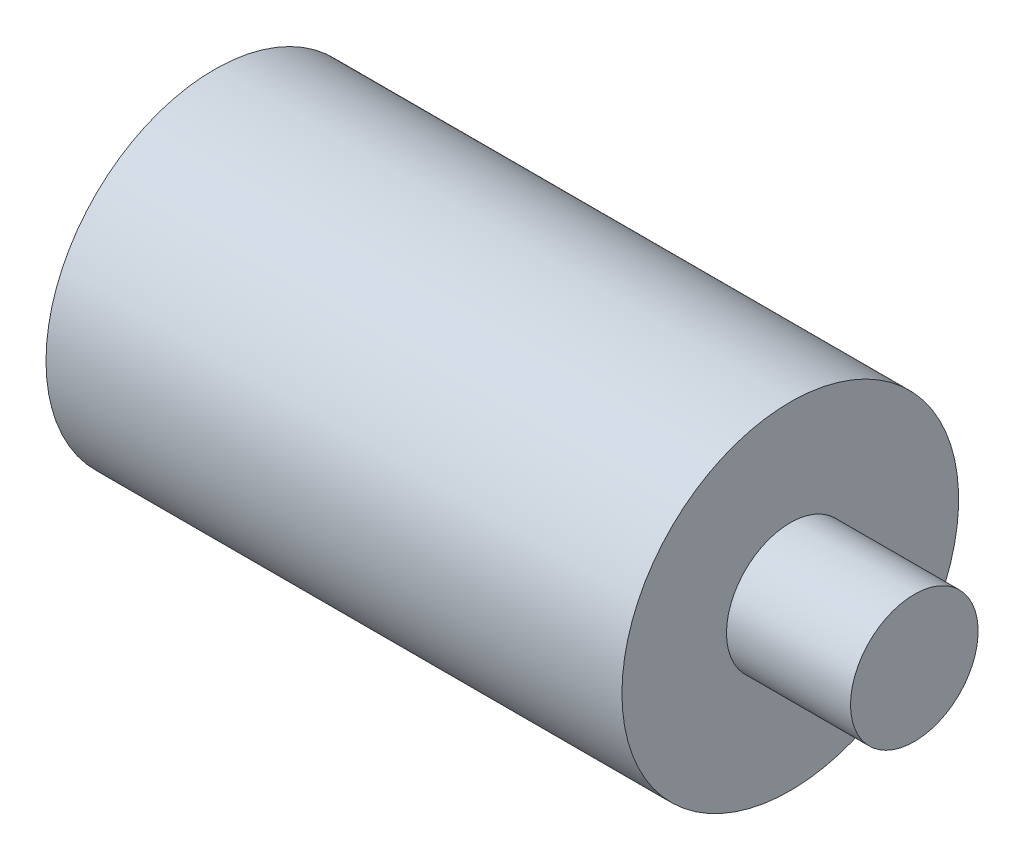
ISO-10303-21;
HEADER;
FILE_DESCRIPTION(('STEP AP214'),'2;1');
FILE_NAME('part.step','',(''),(''),'','','');
FILE_SCHEMA(('AUTOMOTIVE_DESIGN { 1 0 10303 214 1 1 1 1 }'));
ENDSEC;
DATA;
#1=APPLICATION_CONTEXT('core data for automotive mechanical design processes');
#2=APPLICATION_PROTOCOL_DEFINITION('international standard','automotive_design',2000,#1);
#3=PRODUCT_CONTEXT('',#1,'mechanical');
#4=PRODUCT('Part','Part','',(#3));
#5=PRODUCT_RELATED_PRODUCT_CATEGORY('part','',(#4));
#6=PRODUCT_DEFINITION_FORMATION('','',#4);
#7=PRODUCT_DEFINITION_CONTEXT('part definition',#1,'design');
#8=PRODUCT_DEFINITION('design','',#6,#7);
#9=PRODUCT_DEFINITION_SHAPE('','',#8);
#10=(LENGTH_UNIT() NAMED_UNIT(*) SI_UNIT(.MILLI.,.METRE.));
#11=(NAMED_UNIT(*) PLANE_ANGLE_UNIT() SI_UNIT($,.RADIAN.));
#12=(NAMED_UNIT(*) SI_UNIT($,.STERADIAN.) SOLID_ANGLE_UNIT());
#13=UNCERTAINTY_MEASURE_WITH_UNIT(LENGTH_MEASURE(1.E-05),#10,'distance_accuracy_value','');
#14=(GEOMETRIC_REPRESENTATION_CONTEXT(3) GLOBAL_UNCERTAINTY_ASSIGNED_CONTEXT((#13)) GLOBAL_UNIT_ASSIGNED_CONTEXT((#10,
#11,#12)) REPRESENTATION_CONTEXT('',''));
#15=CARTESIAN_POINT('',(0.,0.,0.));
#16=DIRECTION('',(0.,0.,1.));
#17=DIRECTION('',(1.,0.,0.));
#18=AXIS2_PLACEMENT_3D('',#15,#16,#17);
#19=CARTESIAN_POINT('',(14.,0.,0.));
#20=DIRECTION('',(-1.,0.,0.));
#21=DIRECTION('',(0.,0.,1.));
#22=AXIS2_PLACEMENT_3D('',#19,#20,#21);
#23=PLANE('',#22);
#24=CARTESIAN_POINT('',(14.,0.,0.));
#25=DIRECTION('',(-1.,0.,0.));
#26=DIRECTION('',(0.,0.,1.));
#27=AXIS2_PLACEMENT_3D('',#24,#25,#26);
#28=CIRCLE('',#27,7.2);
#29=CARTESIAN_POINT('',(14.,0.,7.2));
#30=VERTEX_POINT('',#29);
#31=EDGE_CURVE('E10',#30,#30,#28,.T.);
#32=ORIENTED_EDGE('',*,*,#31,.F.);
#33=EDGE_LOOP('',(#32));
#34=FACE_BOUND('',#33,.T.);
#35=ADVANCED_FACE('F39',(#34),#23,.F.);
#36=CARTESIAN_POINT('',(-1000.,0.,0.));
#37=DIRECTION('',(-1.,0.,0.));
#38=DIRECTION('',(0.,0.,1.));
#39=AXIS2_PLACEMENT_3D('',#36,#37,#38);
#40=CYLINDRICAL_SURFACE('',#39,7.2);
#41=CARTESIAN_POINT('',(0.,0.,0.));
#42=DIRECTION('',(-1.,0.,0.));
#43=DIRECTION('',(0.,0.,1.));
#44=AXIS2_PLACEMENT_3D('',#41,#42,#43);
#45=CIRCLE('',#44,7.2);
#46=CARTESIAN_POINT('',(0.,0.,7.2));
#47=VERTEX_POINT('',#46);
#48=EDGE_CURVE('E46',#47,#47,#45,.T.);
#49=ORIENTED_EDGE('',*,*,#48,.F.);
#50=EDGE_LOOP('',(#49));
#51=FACE_BOUND('',#50,.T.);
#52=ORIENTED_EDGE('',*,*,#31,.T.);
#53=EDGE_LOOP('',(#52));
#54=FACE_BOUND('',#53,.T.);
#55=ADVANCED_FACE('F85',(#51,#54),#40,.T.);
#56=CARTESIAN_POINT('',(0.,7.2,0.));
#57=DIRECTION('',(-1.,0.,0.));
#58=DIRECTION('',(0.,0.,1.));
#59=AXIS2_PLACEMENT_3D('',#56,#57,#58);
#60=PLANE('',#59);
#61=CARTESIAN_POINT('',(0.,0.,0.));
#62=DIRECTION('',(-1.,0.,0.));
#63=DIRECTION('',(0.,0.,1.));
#64=AXIS2_PLACEMENT_3D('',#61,#62,#63);
#65=CIRCLE('',#64,19.);
#66=CARTESIAN_POINT('',(0.,0.,19.));
#67=VERTEX_POINT('',#66);
#68=EDGE_CURVE('E49',#67,#67,#65,.T.);
#69=ORIENTED_EDGE('',*,*,#68,.F.);
#70=EDGE_LOOP('',(#69));
#71=FACE_BOUND('',#70,.T.);
#72=ORIENTED_EDGE('',*,*,#48,.T.);
#73=EDGE_LOOP('',(#72));
#74=FACE_BOUND('',#73,.T.);
#75=ADVANCED_FACE('F76',(#71,#74),#60,.F.);
#76=CARTESIAN_POINT('',(-1000.,0.,0.));
#77=DIRECTION('',(-1.,0.,0.));
#78=DIRECTION('',(0.,0.,1.));
#79=AXIS2_PLACEMENT_3D('',#76,#77,#78);
#80=CYLINDRICAL_SURFACE('',#79,19.);
#81=CARTESIAN_POINT('',(-64.9999999999999,0.,0.));
#82=DIRECTION('',(-1.,0.,0.));
#83=DIRECTION('',(0.,0.,1.));
#84=AXIS2_PLACEMENT_3D('',#81,#82,#83);
#85=CIRCLE('',#84,19.);
#86=CARTESIAN_POINT('',(-64.9999999999999,0.,19.));
#87=VERTEX_POINT('',#86);
#88=EDGE_CURVE('E54',#87,#87,#85,.T.);
#89=ORIENTED_EDGE('',*,*,#88,.F.);
#90=EDGE_LOOP('',(#89));
#91=FACE_BOUND('',#90,.T.);
#92=ORIENTED_EDGE('',*,*,#68,.T.);
#93=EDGE_LOOP('',(#92));
#94=FACE_BOUND('',#93,.T.);
#95=ADVANCED_FACE('F69',(#91,#94),#80,.T.);
#96=CARTESIAN_POINT('',(-65.,19.,0.));
#97=DIRECTION('',(1.,0.,0.));
#98=DIRECTION('',(0.,0.,-1.));
#99=AXIS2_PLACEMENT_3D('',#96,#97,#98);
#100=PLANE('',#99);
#101=CARTESIAN_POINT('',(-64.9999999999999,0.,0.));
#102=DIRECTION('',(1.,0.,0.));
#103=DIRECTION('',(0.,0.,-1.));
#104=AXIS2_PLACEMENT_3D('',#101,#102,#103);
#105=CIRCLE('',#104,10.);
#106=CARTESIAN_POINT('',(-64.9999999999999,0.,-10.));
#107=VERTEX_POINT('',#106);
#108=EDGE_CURVE('E45',#107,#107,#105,.F.);
#109=ORIENTED_EDGE('',*,*,#108,.F.);
#110=EDGE_LOOP('',(#109));
#111=FACE_BOUND('',#110,.T.);
#112=ORIENTED_EDGE('',*,*,#88,.T.);
#113=EDGE_LOOP('',(#112));
#114=FACE_BOUND('',#113,.T.);
#115=ADVANCED_FACE('F70',(#111,#114),#100,.F.);
#116=CARTESIAN_POINT('',(-1000.,0.,0.));
#117=DIRECTION('',(-1.,0.,0.));
#118=DIRECTION('',(0.,0.,1.));
#119=AXIS2_PLACEMENT_3D('',#116,#117,#118);
#120=CYLINDRICAL_SURFACE('',#119,10.);
#121=CARTESIAN_POINT('',(-51.,0.,0.));
#122=DIRECTION('',(-1.,0.,0.));
#123=DIRECTION('',(0.,0.,1.));
#124=AXIS2_PLACEMENT_3D('',#121,#122,#123);
#125=CIRCLE('',#124,10.);
#126=CARTESIAN_POINT('',(-51.,0.,10.));
#127=VERTEX_POINT('',#126);
#128=EDGE_CURVE('E59',#127,#127,#125,.T.);
#129=ORIENTED_EDGE('',*,*,#128,.F.);
#130=EDGE_LOOP('',(#129));
#131=FACE_BOUND('',#130,.T.);
#132=ORIENTED_EDGE('',*,*,#108,.T.);
#133=EDGE_LOOP('',(#132));
#134=FACE_BOUND('',#133,.T.);
#135=ADVANCED_FACE('F64',(#131,#134),#120,.F.);
#136=CARTESIAN_POINT('',(-51.,0.,0.));
#137=DIRECTION('',(-1.,0.,0.));
#138=DIRECTION('',(0.,0.,1.));
#139=AXIS2_PLACEMENT_3D('',#136,#137,#138);
#140=PLANE('',#139);
#141=ORIENTED_EDGE('',*,*,#128,.T.);
#142=EDGE_LOOP('',(#141));
#143=FACE_BOUND('',#142,.T.);
#144=ADVANCED_FACE('F95',(#143),#140,.T.);
#145=CLOSED_SHELL('',(#35,#55,#75,#95,#115,#135,#144));
#146=MANIFOLD_SOLID_BREP('B2',#145);
#147=ADVANCED_BREP_SHAPE_REPRESENTATION('',(#18,#146),#14);
#148=SHAPE_DEFINITION_REPRESENTATION(#9,#147);
ENDSEC;
END-ISO-10303-21;
